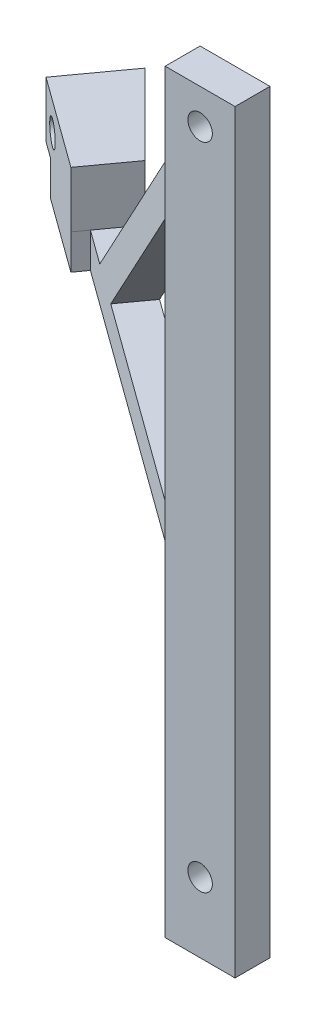
ISO-10303-21;
HEADER;
FILE_DESCRIPTION(('STEP AP214'),'2;1');
FILE_NAME('part.step','',(''),(''),'','','');
FILE_SCHEMA(('AUTOMOTIVE_DESIGN { 1 0 10303 214 1 1 1 1 }'));
ENDSEC;
DATA;
#1=APPLICATION_CONTEXT('core data for automotive mechanical design processes');
#2=APPLICATION_PROTOCOL_DEFINITION('international standard','automotive_design',2000,#1);
#3=PRODUCT_CONTEXT('',#1,'mechanical');
#4=PRODUCT('Part','Part','',(#3));
#5=PRODUCT_RELATED_PRODUCT_CATEGORY('part','',(#4));
#6=PRODUCT_DEFINITION_FORMATION('','',#4);
#7=PRODUCT_DEFINITION_CONTEXT('part definition',#1,'design');
#8=PRODUCT_DEFINITION('design','',#6,#7);
#9=PRODUCT_DEFINITION_SHAPE('','',#8);
#10=(LENGTH_UNIT() NAMED_UNIT(*) SI_UNIT(.MILLI.,.METRE.));
#11=(NAMED_UNIT(*) PLANE_ANGLE_UNIT() SI_UNIT($,.RADIAN.));
#12=(NAMED_UNIT(*) SI_UNIT($,.STERADIAN.) SOLID_ANGLE_UNIT());
#13=UNCERTAINTY_MEASURE_WITH_UNIT(LENGTH_MEASURE(1.E-05),#10,'distance_accuracy_value','');
#14=(GEOMETRIC_REPRESENTATION_CONTEXT(3) GLOBAL_UNCERTAINTY_ASSIGNED_CONTEXT((#13)) GLOBAL_UNIT_ASSIGNED_CONTEXT((#10,
#11,#12)) REPRESENTATION_CONTEXT('',''));
#15=CARTESIAN_POINT('',(0.,0.,0.));
#16=DIRECTION('',(0.,0.,1.));
#17=DIRECTION('',(1.,0.,0.));
#18=AXIS2_PLACEMENT_3D('',#15,#16,#17);
#19=CARTESIAN_POINT('',(0.,54.1,0.));
#20=DIRECTION('',(0.,-1.,0.));
#21=DIRECTION('',(0.,0.,-1.));
#22=AXIS2_PLACEMENT_3D('',#19,#20,#21);
#23=PLANE('',#22);
#24=DIRECTION('',(0.587075126791081,0.,-0.809532454879504));
#25=VECTOR('',#24,1.);
#26=CARTESIAN_POINT('',(-45.1067919466877,54.1,-21.6152784922297));
#27=LINE('',#26,#25);
#28=CARTESIAN_POINT('',(-43.9326416930919,54.1,-23.2343434020075));
#29=VERTEX_POINT('',#28);
#30=CARTESIAN_POINT('',(-40.9972660590942,54.1,-27.2820056764633));
#31=VERTEX_POINT('',#30);
#32=EDGE_CURVE('E220',#29,#31,#27,.T.);
#33=ORIENTED_EDGE('',*,*,#32,.F.);
#34=DIRECTION('',(0.809529625656388,0.,0.587079028057236));
#35=VECTOR('',#34,1.);
#36=CARTESIAN_POINT('',(-43.9326338905732,54.1,-23.2343377435424));
#37=LINE('',#36,#35);
#38=CARTESIAN_POINT('',(-39.057775776704,54.1,-19.6990416003201));
#39=VERTEX_POINT('',#38);
#40=EDGE_CURVE('E268',#29,#39,#37,.T.);
#41=ORIENTED_EDGE('',*,*,#40,.T.);
#42=DIRECTION('',(-0.587079028057236,0.,0.809529625656387));
#43=VECTOR('',#42,1.);
#44=CARTESIAN_POINT('',(-1.19266102762809,54.1,-71.9116581362784));
#45=LINE('',#44,#43);
#46=CARTESIAN_POINT('',(-36.1223806364178,54.1,-23.746689728602));
#47=VERTEX_POINT('',#46);
#48=EDGE_CURVE('E390',#47,#39,#45,.T.);
#49=ORIENTED_EDGE('',*,*,#48,.F.);
#50=DIRECTION('',(-0.809529625656388,0.,-0.587079028057236));
#51=VECTOR('',#50,1.);
#52=CARTESIAN_POINT('',(-3.37781316278733,54.1,0.));
#53=LINE('',#52,#51);
#54=EDGE_CURVE('E388',#47,#31,#53,.T.);
#55=ORIENTED_EDGE('',*,*,#54,.T.);
#56=EDGE_LOOP('',(#33,#41,#49,#55));
#57=FACE_BOUND('',#56,.T.);
#58=ADVANCED_FACE('F39',(#57),#23,.F.);
#59=CARTESIAN_POINT('',(-5.,0.,5.));
#60=DIRECTION('',(1.,0.,0.));
#61=DIRECTION('',(0.,1.,0.));
#62=AXIS2_PLACEMENT_3D('',#59,#60,#61);
#63=PLANE('',#62);
#64=DIRECTION('',(0.,-1.,0.));
#65=VECTOR('',#64,1.);
#66=CARTESIAN_POINT('',(-5.,0.,0.));
#67=LINE('',#66,#65);
#68=CARTESIAN_POINT('',(-5.00000000000005,108.,0.));
#69=VERTEX_POINT('',#68);
#70=CARTESIAN_POINT('',(-5.00000000000005,93.2356726715789,0.));
#71=VERTEX_POINT('',#70);
#72=EDGE_CURVE('E311',#69,#71,#67,.T.);
#73=ORIENTED_EDGE('',*,*,#72,.T.);
#74=DIRECTION('',(0.,0.506279141836731,0.862369660030467));
#75=VECTOR('',#74,1.);
#76=CARTESIAN_POINT('',(-5.00000000000004,71.5206372869894,-36.9882662244794));
#77=LINE('',#76,#75);
#78=CARTESIAN_POINT('',(-5.00000000000004,96.1710678118651,4.99999999999999));
#79=VERTEX_POINT('',#78);
#80=EDGE_CURVE('E401',#71,#79,#77,.T.);
#81=ORIENTED_EDGE('',*,*,#80,.T.);
#82=DIRECTION('',(0.,-1.,0.));
#83=VECTOR('',#82,1.);
#84=CARTESIAN_POINT('',(-5.,0.,5.));
#85=LINE('',#84,#83);
#86=CARTESIAN_POINT('',(-5.00000000000005,108.,5.));
#87=VERTEX_POINT('',#86);
#88=EDGE_CURVE('E299',#87,#79,#85,.T.);
#89=ORIENTED_EDGE('',*,*,#88,.F.);
#90=DIRECTION('',(0.,0.,-1.));
#91=VECTOR('',#90,1.);
#92=CARTESIAN_POINT('',(-5.00000000000005,108.,5.));
#93=LINE('',#92,#91);
#94=EDGE_CURVE('E321',#87,#69,#93,.T.);
#95=ORIENTED_EDGE('',*,*,#94,.T.);
#96=EDGE_LOOP('',(#73,#81,#89,#95));
#97=FACE_BOUND('',#96,.T.);
#98=ADVANCED_FACE('F432',(#97),#63,.F.);
#99=CARTESIAN_POINT('',(-5.00000000000004,89.0999999999996,5.));
#100=VERTEX_POINT('',#99);
#101=CARTESIAN_POINT('',(-5.00000000000003,54.1,5.));
#102=VERTEX_POINT('',#101);
#103=EDGE_CURVE('E303',#100,#102,#85,.T.);
#104=ORIENTED_EDGE('',*,*,#103,.F.);
#105=DIRECTION('',(0.,-0.506279141836731,-0.862369660030467));
#106=VECTOR('',#105,1.);
#107=CARTESIAN_POINT('',(-5.00000000000003,66.2620154612085,-33.9010396340794));
#108=LINE('',#107,#106);
#109=CARTESIAN_POINT('',(-5.00000000000005,86.1646048597134,0.));
#110=VERTEX_POINT('',#109);
#111=EDGE_CURVE('E406',#100,#110,#108,.T.);
#112=ORIENTED_EDGE('',*,*,#111,.T.);
#113=CARTESIAN_POINT('',(-5.00000000000003,54.1,0.));
#114=VERTEX_POINT('',#113);
#115=EDGE_CURVE('E314',#110,#114,#67,.T.);
#116=ORIENTED_EDGE('',*,*,#115,.T.);
#117=DIRECTION('',(0.,0.,-1.));
#118=VECTOR('',#117,1.);
#119=CARTESIAN_POINT('',(-5.00000000000003,54.1,5.));
#120=LINE('',#119,#118);
#121=EDGE_CURVE('E275',#102,#114,#120,.T.);
#122=ORIENTED_EDGE('',*,*,#121,.F.);
#123=EDGE_LOOP('',(#104,#112,#116,#122));
#124=FACE_BOUND('',#123,.T.);
#125=ADVANCED_FACE('F467',(#124),#63,.F.);
#126=CARTESIAN_POINT('',(0.,0.,0.));
#127=DIRECTION('',(0.,0.,-1.));
#128=DIRECTION('',(-1.,0.,0.));
#129=AXIS2_PLACEMENT_3D('',#126,#127,#128);
#130=PLANE('',#129);
#131=DIRECTION('',(0.777242659969747,0.629200959569478,0.));
#132=VECTOR('',#131,1.);
#133=CARTESIAN_POINT('',(-47.5756129864405,58.7694526285749,0.));
#134=LINE('',#133,#132);
#135=CARTESIAN_POINT('',(-3.37781316278733,94.5488809746524,0.));
#136=VERTEX_POINT('',#135);
#137=EDGE_CURVE('E404',#71,#136,#134,.T.);
#138=ORIENTED_EDGE('',*,*,#137,.F.);
#139=ORIENTED_EDGE('',*,*,#72,.F.);
#140=DIRECTION('',(-1.,0.,0.));
#141=VECTOR('',#140,1.);
#142=CARTESIAN_POINT('',(-5.00000000000005,108.,0.));
#143=LINE('',#142,#141);
#144=CARTESIAN_POINT('',(4.99999999999999,108.,0.));
#145=VERTEX_POINT('',#144);
#146=EDGE_CURVE('E308',#145,#69,#143,.T.);
#147=ORIENTED_EDGE('',*,*,#146,.F.);
#148=DIRECTION('',(0.,1.,0.));
#149=VECTOR('',#148,1.);
#150=CARTESIAN_POINT('',(4.99999999999999,108.,0.));
#151=LINE('',#150,#149);
#152=CARTESIAN_POINT('',(5.,0.,0.));
#153=VERTEX_POINT('',#152);
#154=EDGE_CURVE('E283',#153,#145,#151,.T.);
#155=ORIENTED_EDGE('',*,*,#154,.F.);
#156=DIRECTION('',(1.,0.,0.));
#157=VECTOR('',#156,1.);
#158=CARTESIAN_POINT('',(5.,0.,0.));
#159=LINE('',#158,#157);
#160=CARTESIAN_POINT('',(-5.,0.,0.));
#161=VERTEX_POINT('',#160);
#162=EDGE_CURVE('E296',#161,#153,#159,.T.);
#163=ORIENTED_EDGE('',*,*,#162,.F.);
#164=CARTESIAN_POINT('',(-5.00000000000005,49.1,0.));
#165=VERTEX_POINT('',#164);
#166=EDGE_CURVE('E310',#165,#161,#67,.T.);
#167=ORIENTED_EDGE('',*,*,#166,.F.);
#168=DIRECTION('',(-1.,0.,0.));
#169=VECTOR('',#168,1.);
#170=CARTESIAN_POINT('',(0.,49.1,0.));
#171=LINE('',#170,#169);
#172=CARTESIAN_POINT('',(-3.37781316278732,49.1,0.));
#173=VERTEX_POINT('',#172);
#174=EDGE_CURVE('E48',#173,#165,#171,.T.);
#175=ORIENTED_EDGE('',*,*,#174,.F.);
#176=DIRECTION('',(0.,-1.,0.));
#177=VECTOR('',#176,1.);
#178=CARTESIAN_POINT('',(-3.37781316278733,54.1,0.));
#179=LINE('',#178,#177);
#180=CARTESIAN_POINT('',(-3.37781316278733,54.1,0.));
#181=VERTEX_POINT('',#180);
#182=EDGE_CURVE('E358',#181,#173,#179,.T.);
#183=ORIENTED_EDGE('',*,*,#182,.F.);
#184=DIRECTION('',(-1.,0.,0.));
#185=VECTOR('',#184,1.);
#186=CARTESIAN_POINT('',(0.,54.1,0.));
#187=LINE('',#186,#185);
#188=EDGE_CURVE('E11',#181,#114,#187,.T.);
#189=ORIENTED_EDGE('',*,*,#188,.T.);
#190=ORIENTED_EDGE('',*,*,#115,.F.);
#191=DIRECTION('',(-0.777242659969747,-0.629200959569478,0.));
#192=VECTOR('',#191,1.);
#193=CARTESIAN_POINT('',(-44.1175650615524,54.4977770588459,0.));
#194=LINE('',#193,#192);
#195=CARTESIAN_POINT('',(-3.37781316278734,87.477813162787,0.));
#196=VERTEX_POINT('',#195);
#197=EDGE_CURVE('E409',#196,#110,#194,.T.);
#198=ORIENTED_EDGE('',*,*,#197,.F.);
#199=DIRECTION('',(0.,1.,0.));
#200=VECTOR('',#199,1.);
#201=CARTESIAN_POINT('',(-3.37781316278732,0.,0.));
#202=LINE('',#201,#200);
#203=EDGE_CURVE('E411',#196,#136,#202,.T.);
#204=ORIENTED_EDGE('',*,*,#203,.T.);
#205=EDGE_LOOP('',(#138,#139,#147,#155,#163,#167,#175,#183,#189,#190,#198,#204));
#206=FACE_BOUND('',#205,.T.);
#207=CARTESIAN_POINT('',(0.,10.,0.));
#208=DIRECTION('',(0.,0.,1.));
#209=DIRECTION('',(1.,0.,0.));
#210=AXIS2_PLACEMENT_3D('',#207,#208,#209);
#211=CIRCLE('',#210,1.75);
#212=CARTESIAN_POINT('',(1.75,10.,0.));
#213=VERTEX_POINT('',#212);
#214=EDGE_CURVE('E280',#213,#213,#211,.T.);
#215=ORIENTED_EDGE('',*,*,#214,.T.);
#216=EDGE_LOOP('',(#215));
#217=FACE_BOUND('',#216,.T.);
#218=CARTESIAN_POINT('',(0.,103.,0.));
#219=DIRECTION('',(0.,0.,1.));
#220=DIRECTION('',(1.,0.,0.));
#221=AXIS2_PLACEMENT_3D('',#218,#219,#220);
#222=CIRCLE('',#221,1.75);
#223=CARTESIAN_POINT('',(1.75,103.,0.));
#224=VERTEX_POINT('',#223);
#225=EDGE_CURVE('E279',#224,#224,#222,.T.);
#226=ORIENTED_EDGE('',*,*,#225,.T.);
#227=EDGE_LOOP('',(#226));
#228=FACE_BOUND('',#227,.T.);
#229=ADVANCED_FACE('F441',(#206,#217,#228),#130,.T.);
#230=CARTESIAN_POINT('',(4.99999999999999,108.,5.));
#231=DIRECTION('',(-1.,0.,0.));
#232=DIRECTION('',(0.,-1.,0.));
#233=AXIS2_PLACEMENT_3D('',#230,#231,#232);
#234=PLANE('',#233);
#235=ORIENTED_EDGE('',*,*,#154,.T.);
#236=DIRECTION('',(0.,0.,-1.));
#237=VECTOR('',#236,1.);
#238=CARTESIAN_POINT('',(4.99999999999999,108.,5.));
#239=LINE('',#238,#237);
#240=CARTESIAN_POINT('',(4.99999999999999,108.,5.));
#241=VERTEX_POINT('',#240);
#242=EDGE_CURVE('E324',#241,#145,#239,.T.);
#243=ORIENTED_EDGE('',*,*,#242,.F.);
#244=DIRECTION('',(0.,1.,0.));
#245=VECTOR('',#244,1.);
#246=CARTESIAN_POINT('',(4.99999999999999,108.,5.));
#247=LINE('',#246,#245);
#248=CARTESIAN_POINT('',(5.,0.,5.));
#249=VERTEX_POINT('',#248);
#250=EDGE_CURVE('E292',#249,#241,#247,.T.);
#251=ORIENTED_EDGE('',*,*,#250,.F.);
#252=DIRECTION('',(0.,0.,-1.));
#253=VECTOR('',#252,1.);
#254=CARTESIAN_POINT('',(5.,0.,5.));
#255=LINE('',#254,#253);
#256=EDGE_CURVE('E305',#249,#153,#255,.T.);
#257=ORIENTED_EDGE('',*,*,#256,.T.);
#258=EDGE_LOOP('',(#235,#243,#251,#257));
#259=FACE_BOUND('',#258,.T.);
#260=ADVANCED_FACE('F41',(#259),#234,.F.);
#261=CARTESIAN_POINT('',(-5.00000000000005,108.,5.));
#262=DIRECTION('',(0.,-1.,0.));
#263=DIRECTION('',(0.,0.,-1.));
#264=AXIS2_PLACEMENT_3D('',#261,#262,#263);
#265=PLANE('',#264);
#266=ORIENTED_EDGE('',*,*,#146,.T.);
#267=ORIENTED_EDGE('',*,*,#94,.F.);
#268=DIRECTION('',(-1.,0.,0.));
#269=VECTOR('',#268,1.);
#270=CARTESIAN_POINT('',(-5.00000000000005,108.,5.));
#271=LINE('',#270,#269);
#272=EDGE_CURVE('E295',#241,#87,#271,.T.);
#273=ORIENTED_EDGE('',*,*,#272,.F.);
#274=ORIENTED_EDGE('',*,*,#242,.T.);
#275=EDGE_LOOP('',(#266,#267,#273,#274));
#276=FACE_BOUND('',#275,.T.);
#277=ADVANCED_FACE('F439',(#276),#265,.F.);
#278=CARTESIAN_POINT('',(-5.00000000000002,49.1,5.));
#279=VERTEX_POINT('',#278);
#280=CARTESIAN_POINT('',(-5.,0.,5.));
#281=VERTEX_POINT('',#280);
#282=EDGE_CURVE('E298',#279,#281,#85,.T.);
#283=ORIENTED_EDGE('',*,*,#282,.F.);
#284=DIRECTION('',(0.,0.,-1.));
#285=VECTOR('',#284,1.);
#286=CARTESIAN_POINT('',(-5.00000000000002,49.1,5.));
#287=LINE('',#286,#285);
#288=EDGE_CURVE('E272',#279,#165,#287,.T.);
#289=ORIENTED_EDGE('',*,*,#288,.T.);
#290=ORIENTED_EDGE('',*,*,#166,.T.);
#291=DIRECTION('',(0.,0.,-1.));
#292=VECTOR('',#291,1.);
#293=CARTESIAN_POINT('',(-5.,0.,5.));
#294=LINE('',#293,#292);
#295=EDGE_CURVE('E318',#281,#161,#294,.T.);
#296=ORIENTED_EDGE('',*,*,#295,.F.);
#297=EDGE_LOOP('',(#283,#289,#290,#296));
#298=FACE_BOUND('',#297,.T.);
#299=ADVANCED_FACE('F455',(#298),#63,.F.);
#300=CARTESIAN_POINT('',(5.,0.,5.));
#301=DIRECTION('',(0.,1.,0.));
#302=DIRECTION('',(-1.,0.,0.));
#303=AXIS2_PLACEMENT_3D('',#300,#301,#302);
#304=PLANE('',#303);
#305=ORIENTED_EDGE('',*,*,#162,.T.);
#306=ORIENTED_EDGE('',*,*,#256,.F.);
#307=DIRECTION('',(1.,0.,0.));
#308=VECTOR('',#307,1.);
#309=CARTESIAN_POINT('',(5.,0.,5.));
#310=LINE('',#309,#308);
#311=EDGE_CURVE('E302',#281,#249,#310,.T.);
#312=ORIENTED_EDGE('',*,*,#311,.F.);
#313=ORIENTED_EDGE('',*,*,#295,.T.);
#314=EDGE_LOOP('',(#305,#306,#312,#313));
#315=FACE_BOUND('',#314,.T.);
#316=ADVANCED_FACE('F459',(#315),#304,.F.);
#317=CARTESIAN_POINT('',(0.,0.,5.));
#318=DIRECTION('',(0.,0.,-1.));
#319=DIRECTION('',(-1.,0.,0.));
#320=AXIS2_PLACEMENT_3D('',#317,#318,#319);
#321=PLANE('',#320);
#322=CARTESIAN_POINT('',(0.,10.,5.));
#323=DIRECTION('',(0.,0.,1.));
#324=DIRECTION('',(1.,0.,0.));
#325=AXIS2_PLACEMENT_3D('',#322,#323,#324);
#326=CIRCLE('',#325,1.75);
#327=CARTESIAN_POINT('',(1.75,10.,5.));
#328=VERTEX_POINT('',#327);
#329=EDGE_CURVE('E284',#328,#328,#326,.T.);
#330=ORIENTED_EDGE('',*,*,#329,.F.);
#331=EDGE_LOOP('',(#330));
#332=FACE_BOUND('',#331,.T.);
#333=CARTESIAN_POINT('',(0.,103.,5.));
#334=DIRECTION('',(0.,0.,1.));
#335=DIRECTION('',(1.,0.,0.));
#336=AXIS2_PLACEMENT_3D('',#333,#334,#335);
#337=CIRCLE('',#336,1.75);
#338=CARTESIAN_POINT('',(1.75,103.,5.));
#339=VERTEX_POINT('',#338);
#340=EDGE_CURVE('E287',#339,#339,#337,.T.);
#341=ORIENTED_EDGE('',*,*,#340,.F.);
#342=EDGE_LOOP('',(#341));
#343=FACE_BOUND('',#342,.T.);
#344=ORIENTED_EDGE('',*,*,#250,.T.);
#345=ORIENTED_EDGE('',*,*,#272,.T.);
#346=ORIENTED_EDGE('',*,*,#88,.T.);
#347=DIRECTION('',(0.,1.,0.));
#348=VECTOR('',#347,1.);
#349=CARTESIAN_POINT('',(-5.00000000000004,96.1710678118651,4.99999999999999));
#350=LINE('',#349,#348);
#351=EDGE_CURVE('E422',#100,#79,#350,.T.);
#352=ORIENTED_EDGE('',*,*,#351,.F.);
#353=ORIENTED_EDGE('',*,*,#103,.T.);
#354=DIRECTION('',(0.,-1.,0.));
#355=VECTOR('',#354,1.);
#356=CARTESIAN_POINT('',(-5.00000000000001,54.1,5.));
#357=LINE('',#356,#355);
#358=EDGE_CURVE('E330',#102,#279,#357,.T.);
#359=ORIENTED_EDGE('',*,*,#358,.T.);
#360=ORIENTED_EDGE('',*,*,#282,.T.);
#361=ORIENTED_EDGE('',*,*,#311,.T.);
#362=EDGE_LOOP('',(#344,#345,#346,#352,#353,#359,#360,#361));
#363=FACE_BOUND('',#362,.T.);
#364=ADVANCED_FACE('F434',(#332,#343,#363),#321,.F.);
#365=CARTESIAN_POINT('',(0.,103.,0.));
#366=DIRECTION('',(0.,0.,1.));
#367=DIRECTION('',(1.,0.,0.));
#368=AXIS2_PLACEMENT_3D('',#365,#366,#367);
#369=CYLINDRICAL_SURFACE('',#368,1.75);
#370=ORIENTED_EDGE('',*,*,#225,.F.);
#371=EDGE_LOOP('',(#370));
#372=FACE_BOUND('',#371,.T.);
#373=ORIENTED_EDGE('',*,*,#340,.T.);
#374=EDGE_LOOP('',(#373));
#375=FACE_BOUND('',#374,.T.);
#376=ADVANCED_FACE('F489',(#372,#375),#369,.F.);
#377=CARTESIAN_POINT('',(0.,10.,0.));
#378=DIRECTION('',(0.,0.,1.));
#379=DIRECTION('',(1.,0.,0.));
#380=AXIS2_PLACEMENT_3D('',#377,#378,#379);
#381=CYLINDRICAL_SURFACE('',#380,1.75);
#382=ORIENTED_EDGE('',*,*,#214,.F.);
#383=EDGE_LOOP('',(#382));
#384=FACE_BOUND('',#383,.T.);
#385=ORIENTED_EDGE('',*,*,#329,.T.);
#386=EDGE_LOOP('',(#385));
#387=FACE_BOUND('',#386,.T.);
#388=ADVANCED_FACE('F481',(#384,#387),#381,.F.);
#389=CARTESIAN_POINT('',(-30.3981417576874,54.1,-19.5954141102852));
#390=VERTEX_POINT('',#389);
#391=EDGE_CURVE('E338',#181,#390,#53,.T.);
#392=ORIENTED_EDGE('',*,*,#391,.T.);
#393=DIRECTION('',(-0.587079028057236,0.,0.809529625656387));
#394=VECTOR('',#393,1.);
#395=CARTESIAN_POINT('',(4.53157785110234,54.1,-67.7603825179616));
#396=LINE('',#395,#394);
#397=CARTESIAN_POINT('',(-33.3335368979736,54.1,-15.5477659820033));
#398=VERTEX_POINT('',#397);
#399=EDGE_CURVE('E64',#390,#398,#396,.T.);
#400=ORIENTED_EDGE('',*,*,#399,.T.);
#401=EDGE_CURVE('E334',#398,#102,#37,.T.);
#402=ORIENTED_EDGE('',*,*,#401,.T.);
#403=ORIENTED_EDGE('',*,*,#121,.T.);
#404=ORIENTED_EDGE('',*,*,#188,.F.);
#405=EDGE_LOOP('',(#392,#400,#402,#403,#404));
#406=FACE_BOUND('',#405,.T.);
#407=ADVANCED_FACE('F471',(#406),#23,.F.);
#408=CARTESIAN_POINT('',(0.,49.1,0.));
#409=DIRECTION('',(0.,-1.,0.));
#410=DIRECTION('',(0.,0.,-1.));
#411=AXIS2_PLACEMENT_3D('',#408,#409,#410);
#412=PLANE('',#411);
#413=CARTESIAN_POINT('',(-47.97,49.1,-29.25));
#414=DIRECTION('',(0.,-1.,0.));
#415=DIRECTION('',(1.,0.,0.));
#416=AXIS2_PLACEMENT_3D('',#413,#414,#415);
#417=CIRCLE('',#416,2.2);
#418=CARTESIAN_POINT('',(-45.77,49.1,-29.25));
#419=VERTEX_POINT('',#418);
#420=EDGE_CURVE('E344',#419,#419,#417,.T.);
#421=ORIENTED_EDGE('',*,*,#420,.F.);
#422=EDGE_LOOP('',(#421));
#423=FACE_BOUND('',#422,.T.);
#424=ORIENTED_EDGE('',*,*,#288,.F.);
#425=DIRECTION('',(0.809529625656388,0.,0.587079028057236));
#426=VECTOR('',#425,1.);
#427=CARTESIAN_POINT('',(-43.9326338905732,49.1,-23.2343377435424));
#428=LINE('',#427,#426);
#429=CARTESIAN_POINT('',(-43.9326338905732,49.1,-23.2343377435424));
#430=VERTEX_POINT('',#429);
#431=EDGE_CURVE('E353',#430,#279,#428,.T.);
#432=ORIENTED_EDGE('',*,*,#431,.F.);
#433=DIRECTION('',(-0.587079028057236,0.,0.809529625656387));
#434=VECTOR('',#433,1.);
#435=CARTESIAN_POINT('',(-43.9326338905732,49.1,-23.2343377435424));
#436=LINE('',#435,#434);
#437=CARTESIAN_POINT('',(-45.1067919466877,49.1,-21.6152784922297));
#438=VERTEX_POINT('',#437);
#439=EDGE_CURVE('E340',#430,#438,#436,.T.);
#440=ORIENTED_EDGE('',*,*,#439,.T.);
#441=DIRECTION('',(-0.809529625656388,0.,-0.587079028057236));
#442=VECTOR('',#441,1.);
#443=CARTESIAN_POINT('',(-45.1067919466877,49.1,-21.6152784922297));
#444=LINE('',#443,#442);
#445=CARTESIAN_POINT('',(-55.6307067297917,49.1,-29.2473273591408));
#446=VERTEX_POINT('',#445);
#447=EDGE_CURVE('E343',#438,#446,#444,.T.);
#448=ORIENTED_EDGE('',*,*,#447,.T.);
#449=DIRECTION('',(-0.587079028057238,0.,0.809529625656386));
#450=VECTOR('',#449,1.);
#451=CARTESIAN_POINT('',(-51.2276140193624,49.1,-35.3187995515637));
#452=LINE('',#451,#450);
#453=CARTESIAN_POINT('',(-51.2276140193624,49.1,-35.3187995515637));
#454=VERTEX_POINT('',#453);
#455=EDGE_CURVE('E261',#454,#446,#452,.T.);
#456=ORIENTED_EDGE('',*,*,#455,.F.);
#457=DIRECTION('',(-0.809529625656388,0.,-0.587079028057236));
#458=VECTOR('',#457,1.);
#459=CARTESIAN_POINT('',(-40.7037288858294,49.1,-27.6867721868197));
#460=LINE('',#459,#458);
#461=CARTESIAN_POINT('',(-40.7037288858294,49.1,-27.6867721868197));
#462=VERTEX_POINT('',#461);
#463=EDGE_CURVE('E347',#462,#454,#460,.T.);
#464=ORIENTED_EDGE('',*,*,#463,.F.);
#465=DIRECTION('',(0.587079028057232,0.,-0.80952962565639));
#466=VECTOR('',#465,1.);
#467=CARTESIAN_POINT('',(-40.997268399858,49.1,-27.2820073739915));
#468=LINE('',#467,#466);
#469=CARTESIAN_POINT('',(-40.997268399858,49.1,-27.2820073739915));
#470=VERTEX_POINT('',#469);
#471=EDGE_CURVE('E349',#470,#462,#468,.T.);
#472=ORIENTED_EDGE('',*,*,#471,.F.);
#473=DIRECTION('',(-0.809529625656388,0.,-0.587079028057236));
#474=VECTOR('',#473,1.);
#475=CARTESIAN_POINT('',(-3.37781316278732,49.1,0.));
#476=LINE('',#475,#474);
#477=EDGE_CURVE('E351',#173,#470,#476,.T.);
#478=ORIENTED_EDGE('',*,*,#477,.F.);
#479=ORIENTED_EDGE('',*,*,#174,.T.);
#480=EDGE_LOOP('',(#424,#432,#440,#448,#456,#464,#472,#478,#479));
#481=FACE_BOUND('',#480,.T.);
#482=ADVANCED_FACE('F373',(#423,#481),#412,.T.);
#483=CARTESIAN_POINT('',(-43.9326338905732,54.1,-23.2343377435424));
#484=DIRECTION('',(0.809529625656387,0.,0.587079028057236));
#485=DIRECTION('',(0.587079028057236,0.,-0.809529625656387));
#486=AXIS2_PLACEMENT_3D('',#483,#484,#485);
#487=PLANE('',#486);
#488=ORIENTED_EDGE('',*,*,#439,.F.);
#489=DIRECTION('',(0.,-1.,0.));
#490=VECTOR('',#489,1.);
#491=CARTESIAN_POINT('',(-43.9326338905732,54.1,-23.2343377435424));
#492=LINE('',#491,#490);
#493=EDGE_CURVE('E276',#29,#430,#492,.T.);
#494=ORIENTED_EDGE('',*,*,#493,.F.);
#495=DIRECTION('',(-0.587079028057236,0.,0.809529625656387));
#496=VECTOR('',#495,1.);
#497=CARTESIAN_POINT('',(-43.9326338905732,54.1,-23.2343377435424));
#498=LINE('',#497,#496);
#499=CARTESIAN_POINT('',(-45.1067919466877,54.1,-21.6152784922297));
#500=VERTEX_POINT('',#499);
#501=EDGE_CURVE('E255',#29,#500,#498,.T.);
#502=ORIENTED_EDGE('',*,*,#501,.T.);
#503=DIRECTION('',(0.,-1.,0.));
#504=VECTOR('',#503,1.);
#505=CARTESIAN_POINT('',(-45.1067919466877,54.1,-21.6152784922297));
#506=LINE('',#505,#504);
#507=EDGE_CURVE('E264',#500,#438,#506,.T.);
#508=ORIENTED_EDGE('',*,*,#507,.T.);
#509=EDGE_LOOP('',(#488,#494,#502,#508));
#510=FACE_BOUND('',#509,.T.);
#511=ADVANCED_FACE('F381',(#510),#487,.T.);
#512=CARTESIAN_POINT('',(-43.9326338905732,54.1,-23.2343377435424));
#513=DIRECTION('',(0.587079028057236,0.,-0.809529625656388));
#514=DIRECTION('',(-0.809529625656388,0.,-0.587079028057236));
#515=AXIS2_PLACEMENT_3D('',#512,#513,#514);
#516=PLANE('',#515);
#517=ORIENTED_EDGE('',*,*,#431,.T.);
#518=ORIENTED_EDGE('',*,*,#358,.F.);
#519=ORIENTED_EDGE('',*,*,#401,.F.);
#520=DIRECTION('',(0.572423887873042,0.707106781186544,0.415127561831681));
#521=VECTOR('',#520,1.);
#522=CARTESIAN_POINT('',(-5.00000000000004,89.0999999999996,4.99999999999999));
#523=LINE('',#522,#521);
#524=EDGE_CURVE('E56',#398,#100,#523,.T.);
#525=ORIENTED_EDGE('',*,*,#524,.T.);
#526=ORIENTED_EDGE('',*,*,#351,.T.);
#527=DIRECTION('',(-0.572423887873042,-0.707106781186544,-0.415127561831681));
#528=VECTOR('',#527,1.);
#529=CARTESIAN_POINT('',(-39.057775776704,54.1,-19.6990416003201));
#530=LINE('',#529,#528);
#531=EDGE_CURVE('E418',#79,#39,#530,.T.);
#532=ORIENTED_EDGE('',*,*,#531,.T.);
#533=ORIENTED_EDGE('',*,*,#40,.F.);
#534=ORIENTED_EDGE('',*,*,#493,.T.);
#535=EDGE_LOOP('',(#517,#518,#519,#525,#526,#532,#533,#534));
#536=FACE_BOUND('',#535,.T.);
#537=ADVANCED_FACE('F425',(#536),#516,.F.);
#538=CARTESIAN_POINT('',(-3.37781316278733,54.1,0.));
#539=DIRECTION('',(-0.587079028057236,0.,0.809529625656388));
#540=DIRECTION('',(0.809529625656388,0.,0.587079028057236));
#541=AXIS2_PLACEMENT_3D('',#538,#539,#540);
#542=PLANE('',#541);
#543=ORIENTED_EDGE('',*,*,#477,.T.);
#544=DIRECTION('',(0.,-1.,0.));
#545=VECTOR('',#544,1.);
#546=CARTESIAN_POINT('',(-40.997268399858,54.1,-27.2820073739915));
#547=LINE('',#546,#545);
#548=EDGE_CURVE('E361',#31,#470,#547,.T.);
#549=ORIENTED_EDGE('',*,*,#548,.F.);
#550=ORIENTED_EDGE('',*,*,#54,.F.);
#551=DIRECTION('',(0.572423887873042,0.707106781186544,0.415127561831681));
#552=VECTOR('',#551,1.);
#553=CARTESIAN_POINT('',(-36.1223806364178,54.1,-23.746689728602));
#554=LINE('',#553,#552);
#555=EDGE_CURVE('E224',#47,#136,#554,.T.);
#556=ORIENTED_EDGE('',*,*,#555,.T.);
#557=ORIENTED_EDGE('',*,*,#203,.F.);
#558=DIRECTION('',(-0.572423887873042,-0.707106781186544,-0.415127561831681));
#559=VECTOR('',#558,1.);
#560=CARTESIAN_POINT('',(-2.06460485971386,89.0999999999996,0.952351871718042));
#561=LINE('',#560,#559);
#562=EDGE_CURVE('E414',#196,#390,#561,.T.);
#563=ORIENTED_EDGE('',*,*,#562,.T.);
#564=ORIENTED_EDGE('',*,*,#391,.F.);
#565=ORIENTED_EDGE('',*,*,#182,.T.);
#566=EDGE_LOOP('',(#543,#549,#550,#556,#557,#563,#564,#565));
#567=FACE_BOUND('',#566,.T.);
#568=ADVANCED_FACE('F395',(#567),#542,.F.);
#569=CARTESIAN_POINT('',(-40.997268399858,54.1,-27.2820073739915));
#570=DIRECTION('',(-0.809529625656391,0.,-0.587079028057232));
#571=DIRECTION('',(-0.587079028057232,0.,0.809529625656391));
#572=AXIS2_PLACEMENT_3D('',#569,#570,#571);
#573=PLANE('',#572);
#574=ORIENTED_EDGE('',*,*,#471,.T.);
#575=DIRECTION('',(0.,-1.,0.));
#576=VECTOR('',#575,1.);
#577=CARTESIAN_POINT('',(-40.7037288858294,54.1,-27.6867721868197));
#578=LINE('',#577,#576);
#579=CARTESIAN_POINT('',(-40.7037284957034,54.1,-27.6867719038964));
#580=VERTEX_POINT('',#579);
#581=EDGE_CURVE('E266',#580,#462,#578,.T.);
#582=ORIENTED_EDGE('',*,*,#581,.F.);
#583=DIRECTION('',(0.587079028057232,0.,-0.80952962565639));
#584=VECTOR('',#583,1.);
#585=CARTESIAN_POINT('',(-40.997268399858,54.1,-27.2820073739915));
#586=LINE('',#585,#584);
#587=EDGE_CURVE('E394',#31,#580,#586,.T.);
#588=ORIENTED_EDGE('',*,*,#587,.F.);
#589=ORIENTED_EDGE('',*,*,#548,.T.);
#590=EDGE_LOOP('',(#574,#582,#588,#589));
#591=FACE_BOUND('',#590,.T.);
#592=ADVANCED_FACE('F396',(#591),#573,.F.);
#593=CARTESIAN_POINT('',(-40.7037288858294,54.1,-27.6867721868197));
#594=DIRECTION('',(-0.587079028057236,0.,0.809529625656388));
#595=DIRECTION('',(0.809529625656388,0.,0.587079028057236));
#596=AXIS2_PLACEMENT_3D('',#593,#594,#595);
#597=PLANE('',#596);
#598=ORIENTED_EDGE('',*,*,#463,.T.);
#599=DIRECTION('',(0.,-1.,0.));
#600=VECTOR('',#599,1.);
#601=CARTESIAN_POINT('',(-51.2276140193624,54.1,-35.3187995515637));
#602=LINE('',#601,#600);
#603=CARTESIAN_POINT('',(-51.2276140193624,54.1,-35.3187995515637));
#604=VERTEX_POINT('',#603);
#605=EDGE_CURVE('E263',#604,#454,#602,.T.);
#606=ORIENTED_EDGE('',*,*,#605,.F.);
#607=DIRECTION('',(-0.809529625656388,0.,-0.587079028057236));
#608=VECTOR('',#607,1.);
#609=CARTESIAN_POINT('',(-40.7037288858294,54.1,-27.6867721868197));
#610=LINE('',#609,#608);
#611=EDGE_CURVE('E251',#580,#604,#610,.T.);
#612=ORIENTED_EDGE('',*,*,#611,.F.);
#613=ORIENTED_EDGE('',*,*,#581,.T.);
#614=EDGE_LOOP('',(#598,#606,#612,#613));
#615=FACE_BOUND('',#614,.T.);
#616=ADVANCED_FACE('F367',(#615),#597,.F.);
#617=CARTESIAN_POINT('',(-51.2276140193624,54.1,-35.3187995515637));
#618=DIRECTION('',(0.809529625656386,0.,0.587079028057238));
#619=DIRECTION('',(0.587079028057238,0.,-0.809529625656386));
#620=AXIS2_PLACEMENT_3D('',#617,#618,#619);
#621=PLANE('',#620);
#622=ORIENTED_EDGE('',*,*,#455,.T.);
#623=DIRECTION('',(0.,-1.,0.));
#624=VECTOR('',#623,1.);
#625=CARTESIAN_POINT('',(-55.6307067297917,54.1,-29.2473273591408));
#626=LINE('',#625,#624);
#627=CARTESIAN_POINT('',(-55.6307067297917,54.1,-29.2473273591408));
#628=VERTEX_POINT('',#627);
#629=EDGE_CURVE('E258',#628,#446,#626,.T.);
#630=ORIENTED_EDGE('',*,*,#629,.F.);
#631=DIRECTION('',(-0.587079028057238,0.,0.809529625656386));
#632=VECTOR('',#631,1.);
#633=CARTESIAN_POINT('',(-51.2276140193624,54.1,-35.3187995515637));
#634=LINE('',#633,#632);
#635=EDGE_CURVE('E248',#604,#628,#634,.T.);
#636=ORIENTED_EDGE('',*,*,#635,.F.);
#637=ORIENTED_EDGE('',*,*,#605,.T.);
#638=EDGE_LOOP('',(#622,#630,#636,#637));
#639=FACE_BOUND('',#638,.T.);
#640=ADVANCED_FACE('F259',(#639),#621,.F.);
#641=CARTESIAN_POINT('',(-45.1067919466877,54.1,-21.6152784922297));
#642=DIRECTION('',(-0.587079028057236,0.,0.809529625656388));
#643=DIRECTION('',(0.809529625656388,0.,0.587079028057236));
#644=AXIS2_PLACEMENT_3D('',#641,#642,#643);
#645=PLANE('',#644);
#646=CARTESIAN_POINT('',(-54.6926922385567,58.1,-28.5670698140617));
#647=DIRECTION('',(-0.587079028057236,0.,0.809529625656388));
#648=DIRECTION('',(0.809529625656388,0.,0.587079028057236));
#649=AXIS2_PLACEMENT_3D('',#646,#647,#648);
#650=ELLIPSE('',#649,1.77201215988024,1.75);
#651=CARTESIAN_POINT('',(-53.2581958981103,58.1,-27.5267586375336));
#652=VERTEX_POINT('',#651);
#653=EDGE_CURVE('E229',#652,#652,#650,.T.);
#654=ORIENTED_EDGE('',*,*,#653,.F.);
#655=EDGE_LOOP('',(#654));
#656=FACE_BOUND('',#655,.T.);
#657=ORIENTED_EDGE('',*,*,#447,.F.);
#658=ORIENTED_EDGE('',*,*,#507,.F.);
#659=DIRECTION('',(0.,-1.,0.));
#660=VECTOR('',#659,1.);
#661=CARTESIAN_POINT('',(-45.1067919466877,62.1,-21.6152784922297));
#662=LINE('',#661,#660);
#663=CARTESIAN_POINT('',(-45.1067919466877,62.1,-21.6152784922297));
#664=VERTEX_POINT('',#663);
#665=EDGE_CURVE('E235',#664,#500,#662,.T.);
#666=ORIENTED_EDGE('',*,*,#665,.F.);
#667=DIRECTION('',(0.809529625656386,0.,0.587079028057238));
#668=VECTOR('',#667,1.);
#669=CARTESIAN_POINT('',(-58.0592956067608,62.1,-31.0085644433126));
#670=LINE('',#669,#668);
#671=CARTESIAN_POINT('',(-58.0592956067608,62.1,-31.0085644433126));
#672=VERTEX_POINT('',#671);
#673=EDGE_CURVE('E203',#672,#664,#670,.T.);
#674=ORIENTED_EDGE('',*,*,#673,.F.);
#675=DIRECTION('',(0.,-1.,0.));
#676=VECTOR('',#675,1.);
#677=CARTESIAN_POINT('',(-58.0592956067608,62.1,-31.0085644433126));
#678=LINE('',#677,#676);
#679=CARTESIAN_POINT('',(-58.0592956067608,54.1,-31.0085644433126));
#680=VERTEX_POINT('',#679);
#681=EDGE_CURVE('E216',#672,#680,#678,.T.);
#682=ORIENTED_EDGE('',*,*,#681,.T.);
#683=DIRECTION('',(0.809529625656386,0.,0.587079028057238));
#684=VECTOR('',#683,1.);
#685=CARTESIAN_POINT('',(-58.0592956067608,54.1,-31.0085644433126));
#686=LINE('',#685,#684);
#687=EDGE_CURVE('E206',#680,#628,#686,.T.);
#688=ORIENTED_EDGE('',*,*,#687,.T.);
#689=ORIENTED_EDGE('',*,*,#629,.T.);
#690=EDGE_LOOP('',(#657,#658,#666,#674,#682,#688,#689));
#691=FACE_BOUND('',#690,.T.);
#692=ADVANCED_FACE('F241',(#656,#691),#645,.T.);
#693=CARTESIAN_POINT('',(-47.97,60.3225396744416,-29.25));
#694=DIRECTION('',(0.,-1.,0.));
#695=DIRECTION('',(1.,0.,0.));
#696=AXIS2_PLACEMENT_3D('',#693,#694,#695);
#697=CYLINDRICAL_SURFACE('',#696,2.2);
#698=CARTESIAN_POINT('',(-47.97,54.1,-29.25));
#699=DIRECTION('',(0.,-1.,0.));
#700=DIRECTION('',(0.,0.,-1.));
#701=AXIS2_PLACEMENT_3D('',#698,#699,#700);
#702=CIRCLE('',#701,2.2);
#703=CARTESIAN_POINT('',(-47.97,54.1,-31.45));
#704=VERTEX_POINT('',#703);
#705=EDGE_CURVE('E212',#704,#704,#702,.F.);
#706=ORIENTED_EDGE('',*,*,#705,.T.);
#707=EDGE_LOOP('',(#706));
#708=FACE_BOUND('',#707,.T.);
#709=ORIENTED_EDGE('',*,*,#420,.T.);
#710=EDGE_LOOP('',(#709));
#711=FACE_BOUND('',#710,.T.);
#712=ADVANCED_FACE('F513',(#708,#711),#697,.F.);
#713=CARTESIAN_POINT('',(-1.19266102762809,54.1,-71.9116581362784));
#714=DIRECTION('',(-0.572423887873036,0.707106781186551,-0.415127561831677));
#715=DIRECTION('',(-0.777242659969747,-0.629200959569478,0.));
#716=AXIS2_PLACEMENT_3D('',#713,#714,#715);
#717=PLANE('',#716);
#718=ORIENTED_EDGE('',*,*,#80,.F.);
#719=ORIENTED_EDGE('',*,*,#137,.T.);
#720=ORIENTED_EDGE('',*,*,#555,.F.);
#721=ORIENTED_EDGE('',*,*,#48,.T.);
#722=ORIENTED_EDGE('',*,*,#531,.F.);
#723=EDGE_LOOP('',(#718,#719,#720,#721,#722));
#724=FACE_BOUND('',#723,.T.);
#725=ADVANCED_FACE('F428',(#724),#717,.T.);
#726=CARTESIAN_POINT('',(32.8651147490759,89.0999999999996,-47.2126165359583));
#727=DIRECTION('',(0.572423887873036,-0.707106781186551,0.415127561831677));
#728=DIRECTION('',(0.777242659969747,0.629200959569478,0.));
#729=AXIS2_PLACEMENT_3D('',#726,#727,#728);
#730=PLANE('',#729);
#731=ORIENTED_EDGE('',*,*,#111,.F.);
#732=ORIENTED_EDGE('',*,*,#524,.F.);
#733=ORIENTED_EDGE('',*,*,#399,.F.);
#734=ORIENTED_EDGE('',*,*,#562,.F.);
#735=ORIENTED_EDGE('',*,*,#197,.T.);
#736=EDGE_LOOP('',(#731,#732,#733,#734,#735));
#737=FACE_BOUND('',#736,.T.);
#738=ADVANCED_FACE('F448',(#737),#730,.T.);
#739=CARTESIAN_POINT('',(0.,54.1,0.));
#740=DIRECTION('',(0.,-1.,0.));
#741=DIRECTION('',(0.,0.,-1.));
#742=AXIS2_PLACEMENT_3D('',#739,#740,#741);
#743=PLANE('',#742);
#744=ORIENTED_EDGE('',*,*,#705,.F.);
#745=EDGE_LOOP('',(#744));
#746=FACE_BOUND('',#745,.T.);
#747=ADVANCED_FACE('F555',(#746),#743,.T.);
#748=ORIENTED_EDGE('',*,*,#611,.T.);
#749=ORIENTED_EDGE('',*,*,#635,.T.);
#750=ORIENTED_EDGE('',*,*,#687,.F.);
#751=DIRECTION('',(-0.587079028057239,0.,0.809529625656386));
#752=VECTOR('',#751,1.);
#753=CARTESIAN_POINT('',(-52.102962866165,54.1,-39.2218161238159));
#754=LINE('',#753,#752);
#755=CARTESIAN_POINT('',(-52.102962866165,54.1,-39.2218161238159));
#756=VERTEX_POINT('',#755);
#757=EDGE_CURVE('E232',#756,#680,#754,.T.);
#758=ORIENTED_EDGE('',*,*,#757,.F.);
#759=DIRECTION('',(-0.707225617206426,0.,-0.706987925191788));
#760=VECTOR('',#759,1.);
#761=CARTESIAN_POINT('',(-40.6450209830236,54.1,-27.7677251493853));
#762=LINE('',#761,#760);
#763=CARTESIAN_POINT('',(-40.6450209830236,54.1,-27.7677251493853));
#764=VERTEX_POINT('',#763);
#765=EDGE_CURVE('E223',#764,#756,#762,.T.);
#766=ORIENTED_EDGE('',*,*,#765,.F.);
#767=EDGE_CURVE('E210',#580,#764,#27,.T.);
#768=ORIENTED_EDGE('',*,*,#767,.F.);
#769=EDGE_LOOP('',(#748,#749,#750,#758,#766,#768));
#770=FACE_BOUND('',#769,.T.);
#771=ADVANCED_FACE('F246',(#770),#743,.T.);
#772=CARTESIAN_POINT('',(-45.1067919466877,62.1,-21.6152784922297));
#773=DIRECTION('',(-0.809532454879504,0.,-0.587075126791081));
#774=DIRECTION('',(-0.587075126791081,0.,0.809532454879504));
#775=AXIS2_PLACEMENT_3D('',#772,#773,#774);
#776=PLANE('',#775);
#777=ORIENTED_EDGE('',*,*,#501,.F.);
#778=ORIENTED_EDGE('',*,*,#32,.T.);
#779=ORIENTED_EDGE('',*,*,#587,.T.);
#780=ORIENTED_EDGE('',*,*,#767,.T.);
#781=DIRECTION('',(0.,-1.,0.));
#782=VECTOR('',#781,1.);
#783=CARTESIAN_POINT('',(-40.6450209830236,62.1,-27.7677251493853));
#784=LINE('',#783,#782);
#785=CARTESIAN_POINT('',(-40.6450209830236,62.1,-27.7677251493853));
#786=VERTEX_POINT('',#785);
#787=EDGE_CURVE('E192',#786,#764,#784,.T.);
#788=ORIENTED_EDGE('',*,*,#787,.F.);
#789=DIRECTION('',(0.587075126791081,0.,-0.809532454879504));
#790=VECTOR('',#789,1.);
#791=CARTESIAN_POINT('',(-45.1067919466877,62.1,-21.6152784922297));
#792=LINE('',#791,#790);
#793=EDGE_CURVE('E198',#664,#786,#792,.T.);
#794=ORIENTED_EDGE('',*,*,#793,.F.);
#795=ORIENTED_EDGE('',*,*,#665,.T.);
#796=EDGE_LOOP('',(#777,#778,#779,#780,#788,#794,#795));
#797=FACE_BOUND('',#796,.T.);
#798=ADVANCED_FACE('F208',(#797),#776,.F.);
#799=CARTESIAN_POINT('',(-40.6450209830236,62.1,-27.7677251493853));
#800=DIRECTION('',(-0.706987925191788,0.,0.707225617206426));
#801=DIRECTION('',(0.707225617206426,0.,0.706987925191788));
#802=AXIS2_PLACEMENT_3D('',#799,#800,#801);
#803=PLANE('',#802);
#804=CARTESIAN_POINT('',(-48.0708899636911,58.1,-35.1910983638991));
#805=DIRECTION('',(0.706987925191788,0.,-0.707225617206426));
#806=DIRECTION('',(-0.707225617206426,0.,-0.706987925191788));
#807=AXIS2_PLACEMENT_3D('',#804,#805,#806);
#808=CIRCLE('',#807,1.75);
#809=CARTESIAN_POINT('',(-49.3085347938024,58.1,-36.4283272329847));
#810=VERTEX_POINT('',#809);
#811=EDGE_CURVE('E732',#810,#810,#808,.T.);
#812=ORIENTED_EDGE('',*,*,#811,.F.);
#813=EDGE_LOOP('',(#812));
#814=FACE_BOUND('',#813,.T.);
#815=ORIENTED_EDGE('',*,*,#765,.T.);
#816=DIRECTION('',(0.,-1.,0.));
#817=VECTOR('',#816,1.);
#818=CARTESIAN_POINT('',(-52.102962866165,62.1,-39.2218161238159));
#819=LINE('',#818,#817);
#820=CARTESIAN_POINT('',(-52.102962866165,62.1,-39.2218161238159));
#821=VERTEX_POINT('',#820);
#822=EDGE_CURVE('E194',#821,#756,#819,.T.);
#823=ORIENTED_EDGE('',*,*,#822,.F.);
#824=DIRECTION('',(-0.707225617206426,0.,-0.706987925191788));
#825=VECTOR('',#824,1.);
#826=CARTESIAN_POINT('',(-40.6450209830236,62.1,-27.7677251493853));
#827=LINE('',#826,#825);
#828=EDGE_CURVE('E188',#786,#821,#827,.T.);
#829=ORIENTED_EDGE('',*,*,#828,.F.);
#830=ORIENTED_EDGE('',*,*,#787,.T.);
#831=EDGE_LOOP('',(#815,#823,#829,#830));
#832=FACE_BOUND('',#831,.T.);
#833=ADVANCED_FACE('F190',(#814,#832),#803,.F.);
#834=CARTESIAN_POINT('',(-52.102962866165,62.1,-39.2218161238159));
#835=DIRECTION('',(0.809529625656386,0.,0.587079028057239));
#836=DIRECTION('',(0.587079028057239,0.,-0.809529625656386));
#837=AXIS2_PLACEMENT_3D('',#834,#835,#836);
#838=PLANE('',#837);
#839=ORIENTED_EDGE('',*,*,#757,.T.);
#840=ORIENTED_EDGE('',*,*,#681,.F.);
#841=DIRECTION('',(-0.587079028057239,0.,0.809529625656386));
#842=VECTOR('',#841,1.);
#843=CARTESIAN_POINT('',(-52.102962866165,62.1,-39.2218161238159));
#844=LINE('',#843,#842);
#845=EDGE_CURVE('E197',#821,#672,#844,.T.);
#846=ORIENTED_EDGE('',*,*,#845,.F.);
#847=ORIENTED_EDGE('',*,*,#822,.T.);
#848=EDGE_LOOP('',(#839,#840,#846,#847));
#849=FACE_BOUND('',#848,.T.);
#850=ADVANCED_FACE('F579',(#849),#838,.F.);
#851=CARTESIAN_POINT('',(0.,62.1,0.));
#852=DIRECTION('',(0.,-1.,0.));
#853=DIRECTION('',(0.,0.,-1.));
#854=AXIS2_PLACEMENT_3D('',#851,#852,#853);
#855=PLANE('',#854);
#856=ORIENTED_EDGE('',*,*,#793,.T.);
#857=ORIENTED_EDGE('',*,*,#828,.T.);
#858=ORIENTED_EDGE('',*,*,#845,.T.);
#859=ORIENTED_EDGE('',*,*,#673,.T.);
#860=EDGE_LOOP('',(#856,#857,#858,#859));
#861=FACE_BOUND('',#860,.T.);
#862=ADVANCED_FACE('F201',(#861),#855,.F.);
#863=CARTESIAN_POINT('',(-73.1589620442029,58.1,-10.0945915786579));
#864=DIRECTION('',(0.706987925191788,0.,-0.707225617206426));
#865=DIRECTION('',(-0.707225617206426,0.,-0.706987925191788));
#866=AXIS2_PLACEMENT_3D('',#863,#864,#865);
#867=CYLINDRICAL_SURFACE('',#866,1.75);
#868=ORIENTED_EDGE('',*,*,#653,.T.);
#869=EDGE_LOOP('',(#868));
#870=FACE_BOUND('',#869,.T.);
#871=ORIENTED_EDGE('',*,*,#811,.T.);
#872=EDGE_LOOP('',(#871));
#873=FACE_BOUND('',#872,.T.);
#874=ADVANCED_FACE('F589',(#870,#873),#867,.F.);
#875=CLOSED_SHELL('',(#58,#98,#125,#229,#260,#277,#299,#316,#364,#376,#388,#407,#482,#511,#537,
#568,#592,#616,#640,#692,#712,#725,#738,#747,#771,#798,#833,#850,#862,#874));
#876=MANIFOLD_SOLID_BREP('B2',#875);
#877=ADVANCED_BREP_SHAPE_REPRESENTATION('',(#18,#876),#14);
#878=SHAPE_DEFINITION_REPRESENTATION(#9,#877);
ENDSEC;
END-ISO-10303-21;
